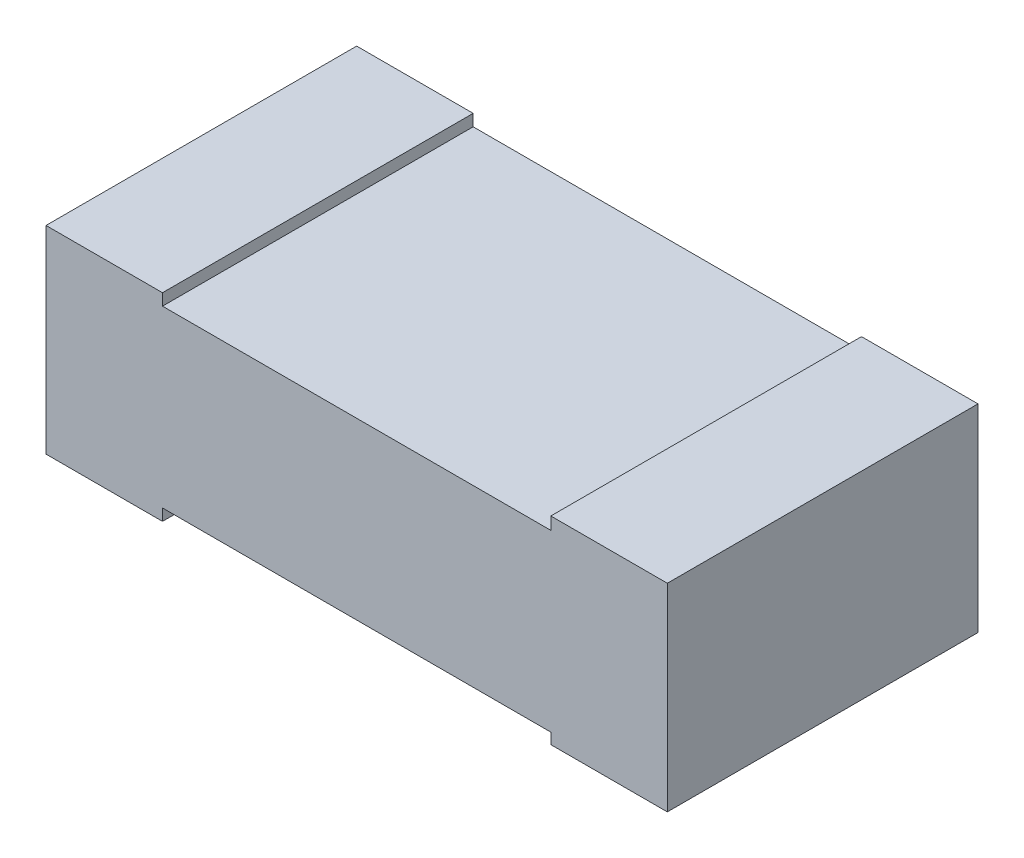
ISO-10303-21;
HEADER;
FILE_DESCRIPTION(('STEP AP214'),'2;1');
FILE_NAME('part.step','',(''),(''),'','','');
FILE_SCHEMA(('AUTOMOTIVE_DESIGN { 1 0 10303 214 1 1 1 1 }'));
ENDSEC;
DATA;
#1=APPLICATION_CONTEXT('core data for automotive mechanical design processes');
#2=APPLICATION_PROTOCOL_DEFINITION('international standard','automotive_design',2000,#1);
#3=PRODUCT_CONTEXT('',#1,'mechanical');
#4=PRODUCT('Part','Part','',(#3));
#5=PRODUCT_RELATED_PRODUCT_CATEGORY('part','',(#4));
#6=PRODUCT_DEFINITION_FORMATION('','',#4);
#7=PRODUCT_DEFINITION_CONTEXT('part definition',#1,'design');
#8=PRODUCT_DEFINITION('design','',#6,#7);
#9=PRODUCT_DEFINITION_SHAPE('','',#8);
#10=(LENGTH_UNIT() NAMED_UNIT(*) SI_UNIT(.MILLI.,.METRE.));
#11=(NAMED_UNIT(*) PLANE_ANGLE_UNIT() SI_UNIT($,.RADIAN.));
#12=(NAMED_UNIT(*) SI_UNIT($,.STERADIAN.) SOLID_ANGLE_UNIT());
#13=UNCERTAINTY_MEASURE_WITH_UNIT(LENGTH_MEASURE(1.E-05),#10,'distance_accuracy_value','');
#14=(GEOMETRIC_REPRESENTATION_CONTEXT(3) GLOBAL_UNCERTAINTY_ASSIGNED_CONTEXT((#13)) GLOBAL_UNIT_ASSIGNED_CONTEXT((#10,
#11,#12)) REPRESENTATION_CONTEXT('',''));
#15=CARTESIAN_POINT('',(0.,0.,0.));
#16=DIRECTION('',(0.,0.,1.));
#17=DIRECTION('',(1.,0.,0.));
#18=AXIS2_PLACEMENT_3D('',#15,#16,#17);
#19=CARTESIAN_POINT('',(0.8,0.,0.));
#20=DIRECTION('',(-1.,0.,0.));
#21=DIRECTION('',(0.,-1.,0.));
#22=AXIS2_PLACEMENT_3D('',#19,#20,#21);
#23=PLANE('',#22);
#24=DIRECTION('',(0.,0.,1.));
#25=VECTOR('',#24,1.);
#26=CARTESIAN_POINT('',(0.8,0.482093023256,0.4));
#27=LINE('',#26,#25);
#28=CARTESIAN_POINT('',(0.8,0.482093023256,0.4));
#29=VERTEX_POINT('',#28);
#30=CARTESIAN_POINT('',(0.8,0.482093023256,-0.4));
#31=VERTEX_POINT('',#30);
#32=EDGE_CURVE('E125',#29,#31,#27,.F.);
#33=ORIENTED_EDGE('',*,*,#32,.F.);
#34=DIRECTION('',(0.,1.,0.));
#35=VECTOR('',#34,1.);
#36=CARTESIAN_POINT('',(0.8,-0.02790697674419,0.4));
#37=LINE('',#36,#35);
#38=CARTESIAN_POINT('',(0.8,-0.02790697674419,0.4));
#39=VERTEX_POINT('',#38);
#40=EDGE_CURVE('E129',#39,#29,#37,.T.);
#41=ORIENTED_EDGE('',*,*,#40,.F.);
#42=DIRECTION('',(0.,0.,1.));
#43=VECTOR('',#42,1.);
#44=CARTESIAN_POINT('',(0.8,-0.02790697674419,-0.4));
#45=LINE('',#44,#43);
#46=CARTESIAN_POINT('',(0.8,-0.02790697674419,-0.4));
#47=VERTEX_POINT('',#46);
#48=EDGE_CURVE('E20',#47,#39,#45,.T.);
#49=ORIENTED_EDGE('',*,*,#48,.F.);
#50=DIRECTION('',(0.,1.,0.));
#51=VECTOR('',#50,1.);
#52=CARTESIAN_POINT('',(0.8,0.482093023256,-0.4));
#53=LINE('',#52,#51);
#54=EDGE_CURVE('E159',#31,#47,#53,.F.);
#55=ORIENTED_EDGE('',*,*,#54,.F.);
#56=EDGE_LOOP('',(#33,#41,#49,#55));
#57=FACE_BOUND('',#56,.T.);
#58=ADVANCED_FACE('F17',(#57),#23,.F.);
#59=CARTESIAN_POINT('',(0.8,-0.02790697674419,-0.4));
#60=DIRECTION('',(0.,-1.,0.));
#61=DIRECTION('',(1.,0.,0.));
#62=AXIS2_PLACEMENT_3D('',#59,#60,#61);
#63=PLANE('',#62);
#64=ORIENTED_EDGE('',*,*,#48,.T.);
#65=DIRECTION('',(1.,0.,0.));
#66=VECTOR('',#65,1.);
#67=CARTESIAN_POINT('',(0.8,-0.02790697674419,0.4));
#68=LINE('',#67,#66);
#69=CARTESIAN_POINT('',(0.5,-0.02790697674419,0.4));
#70=VERTEX_POINT('',#69);
#71=EDGE_CURVE('E122',#70,#39,#68,.T.);
#72=ORIENTED_EDGE('',*,*,#71,.F.);
#73=DIRECTION('',(0.,0.,1.));
#74=VECTOR('',#73,1.);
#75=CARTESIAN_POINT('',(0.5,-0.02790697674419,0.));
#76=LINE('',#75,#74);
#77=CARTESIAN_POINT('',(0.5,-0.0279069767441901,-0.4));
#78=VERTEX_POINT('',#77);
#79=EDGE_CURVE('E110',#78,#70,#76,.T.);
#80=ORIENTED_EDGE('',*,*,#79,.F.);
#81=DIRECTION('',(1.,0.,0.));
#82=VECTOR('',#81,1.);
#83=CARTESIAN_POINT('',(0.8,-0.02790697674419,-0.4));
#84=LINE('',#83,#82);
#85=EDGE_CURVE('E154',#47,#78,#84,.F.);
#86=ORIENTED_EDGE('',*,*,#85,.F.);
#87=EDGE_LOOP('',(#64,#72,#80,#86));
#88=FACE_BOUND('',#87,.T.);
#89=ADVANCED_FACE('F127',(#88),#63,.T.);
#90=CARTESIAN_POINT('',(0.5,0.,0.));
#91=DIRECTION('',(-1.,0.,0.));
#92=DIRECTION('',(0.,-1.,0.));
#93=AXIS2_PLACEMENT_3D('',#90,#91,#92);
#94=PLANE('',#93);
#95=ORIENTED_EDGE('',*,*,#79,.T.);
#96=DIRECTION('',(0.,1.,0.));
#97=VECTOR('',#96,1.);
#98=CARTESIAN_POINT('',(0.5,-0.02790697674419,0.4));
#99=LINE('',#98,#97);
#100=CARTESIAN_POINT('',(0.5,0.,0.4));
#101=VERTEX_POINT('',#100);
#102=EDGE_CURVE('E113',#101,#70,#99,.F.);
#103=ORIENTED_EDGE('',*,*,#102,.F.);
#104=DIRECTION('',(0.,0.,1.));
#105=VECTOR('',#104,1.);
#106=CARTESIAN_POINT('',(0.5,0.,0.4));
#107=LINE('',#106,#105);
#108=CARTESIAN_POINT('',(0.5,0.,-0.4));
#109=VERTEX_POINT('',#108);
#110=EDGE_CURVE('E103',#101,#109,#107,.F.);
#111=ORIENTED_EDGE('',*,*,#110,.T.);
#112=DIRECTION('',(0.,1.,0.));
#113=VECTOR('',#112,1.);
#114=CARTESIAN_POINT('',(0.5,0.482093023256,-0.4));
#115=LINE('',#114,#113);
#116=EDGE_CURVE('E114',#78,#109,#115,.T.);
#117=ORIENTED_EDGE('',*,*,#116,.F.);
#118=EDGE_LOOP('',(#95,#103,#111,#117));
#119=FACE_BOUND('',#118,.T.);
#120=ADVANCED_FACE('F112',(#119),#94,.T.);
#121=CARTESIAN_POINT('',(-0.5,0.,0.4));
#122=DIRECTION('',(0.,1.,0.));
#123=DIRECTION('',(-1.,0.,0.));
#124=AXIS2_PLACEMENT_3D('',#121,#122,#123);
#125=PLANE('',#124);
#126=DIRECTION('',(1.,0.,0.));
#127=VECTOR('',#126,1.);
#128=CARTESIAN_POINT('',(0.8,0.,0.4));
#129=LINE('',#128,#127);
#130=CARTESIAN_POINT('',(-0.5,0.,0.4));
#131=VERTEX_POINT('',#130);
#132=EDGE_CURVE('E124',#131,#101,#129,.T.);
#133=ORIENTED_EDGE('',*,*,#132,.F.);
#134=DIRECTION('',(0.,0.,-1.));
#135=VECTOR('',#134,1.);
#136=CARTESIAN_POINT('',(-0.5,0.,-0.4));
#137=LINE('',#136,#135);
#138=CARTESIAN_POINT('',(-0.5,0.,-0.4));
#139=VERTEX_POINT('',#138);
#140=EDGE_CURVE('E143',#139,#131,#137,.F.);
#141=ORIENTED_EDGE('',*,*,#140,.F.);
#142=DIRECTION('',(1.,0.,0.));
#143=VECTOR('',#142,1.);
#144=CARTESIAN_POINT('',(0.8,0.,-0.4));
#145=LINE('',#144,#143);
#146=EDGE_CURVE('E146',#109,#139,#145,.F.);
#147=ORIENTED_EDGE('',*,*,#146,.F.);
#148=ORIENTED_EDGE('',*,*,#110,.F.);
#149=EDGE_LOOP('',(#133,#141,#147,#148));
#150=FACE_BOUND('',#149,.T.);
#151=ADVANCED_FACE('F147',(#150),#125,.F.);
#152=CARTESIAN_POINT('',(-0.5,0.48,-0.4));
#153=DIRECTION('',(1.,0.,0.));
#154=DIRECTION('',(0.,0.,-1.));
#155=AXIS2_PLACEMENT_3D('',#152,#153,#154);
#156=PLANE('',#155);
#157=DIRECTION('',(0.,1.,0.));
#158=VECTOR('',#157,1.);
#159=CARTESIAN_POINT('',(-0.5,-0.02790697674419,0.4));
#160=LINE('',#159,#158);
#161=CARTESIAN_POINT('',(-0.5,-0.03,0.4));
#162=VERTEX_POINT('',#161);
#163=EDGE_CURVE('E170',#162,#131,#160,.T.);
#164=ORIENTED_EDGE('',*,*,#163,.F.);
#165=DIRECTION('',(0.,0.,-1.));
#166=VECTOR('',#165,1.);
#167=CARTESIAN_POINT('',(-0.5,-0.03,0.));
#168=LINE('',#167,#166);
#169=CARTESIAN_POINT('',(-0.5,-0.03,-0.4));
#170=VERTEX_POINT('',#169);
#171=EDGE_CURVE('E141',#170,#162,#168,.F.);
#172=ORIENTED_EDGE('',*,*,#171,.F.);
#173=DIRECTION('',(0.,1.,0.));
#174=VECTOR('',#173,1.);
#175=CARTESIAN_POINT('',(-0.5,0.482093023256,-0.4));
#176=LINE('',#175,#174);
#177=EDGE_CURVE('E150',#139,#170,#176,.F.);
#178=ORIENTED_EDGE('',*,*,#177,.F.);
#179=ORIENTED_EDGE('',*,*,#140,.T.);
#180=EDGE_LOOP('',(#164,#172,#178,#179));
#181=FACE_BOUND('',#180,.T.);
#182=ADVANCED_FACE('F233',(#181),#156,.T.);
#183=CARTESIAN_POINT('',(0.,-0.03,0.));
#184=DIRECTION('',(0.,-1.,0.));
#185=DIRECTION('',(0.,0.,-1.));
#186=AXIS2_PLACEMENT_3D('',#183,#184,#185);
#187=PLANE('',#186);
#188=DIRECTION('',(1.,0.,0.));
#189=VECTOR('',#188,1.);
#190=CARTESIAN_POINT('',(0.8,-0.03,-0.4));
#191=LINE('',#190,#189);
#192=CARTESIAN_POINT('',(-0.799997168259,-0.03,-0.4));
#193=VERTEX_POINT('',#192);
#194=EDGE_CURVE('E152',#170,#193,#191,.F.);
#195=ORIENTED_EDGE('',*,*,#194,.F.);
#196=ORIENTED_EDGE('',*,*,#171,.T.);
#197=DIRECTION('',(1.,0.,0.));
#198=VECTOR('',#197,1.);
#199=CARTESIAN_POINT('',(0.8,-0.03,0.4));
#200=LINE('',#199,#198);
#201=CARTESIAN_POINT('',(-0.799997168259,-0.03,0.4));
#202=VERTEX_POINT('',#201);
#203=EDGE_CURVE('E172',#202,#162,#200,.T.);
#204=ORIENTED_EDGE('',*,*,#203,.F.);
#205=DIRECTION('',(0.,0.,1.));
#206=VECTOR('',#205,1.);
#207=CARTESIAN_POINT('',(-0.799997168259,-0.03,0.4));
#208=LINE('',#207,#206);
#209=EDGE_CURVE('E139',#193,#202,#208,.T.);
#210=ORIENTED_EDGE('',*,*,#209,.F.);
#211=EDGE_LOOP('',(#195,#196,#204,#210));
#212=FACE_BOUND('',#211,.T.);
#213=ADVANCED_FACE('F210',(#212),#187,.T.);
#214=CARTESIAN_POINT('',(-0.799997168259,0.48,0.4));
#215=DIRECTION('',(-1.,0.,0.));
#216=DIRECTION('',(0.,0.,1.));
#217=AXIS2_PLACEMENT_3D('',#214,#215,#216);
#218=PLANE('',#217);
#219=DIRECTION('',(0.,0.,-1.));
#220=VECTOR('',#219,1.);
#221=CARTESIAN_POINT('',(-0.799997168259,0.48,0.));
#222=LINE('',#221,#220);
#223=CARTESIAN_POINT('',(-0.799997168259,0.48,0.4));
#224=VERTEX_POINT('',#223);
#225=CARTESIAN_POINT('',(-0.799997168259,0.48,-0.4));
#226=VERTEX_POINT('',#225);
#227=EDGE_CURVE('E136',#224,#226,#222,.T.);
#228=ORIENTED_EDGE('',*,*,#227,.T.);
#229=DIRECTION('',(0.,1.,0.));
#230=VECTOR('',#229,1.);
#231=CARTESIAN_POINT('',(-0.799997168259,0.482093023256,-0.4));
#232=LINE('',#231,#230);
#233=EDGE_CURVE('E202',#193,#226,#232,.T.);
#234=ORIENTED_EDGE('',*,*,#233,.F.);
#235=ORIENTED_EDGE('',*,*,#209,.T.);
#236=DIRECTION('',(0.,1.,0.));
#237=VECTOR('',#236,1.);
#238=CARTESIAN_POINT('',(-0.799997168259,-0.02790697674419,0.4));
#239=LINE('',#238,#237);
#240=EDGE_CURVE('E175',#224,#202,#239,.F.);
#241=ORIENTED_EDGE('',*,*,#240,.F.);
#242=EDGE_LOOP('',(#228,#234,#235,#241));
#243=FACE_BOUND('',#242,.T.);
#244=ADVANCED_FACE('F213',(#243),#218,.T.);
#245=CARTESIAN_POINT('',(0.,0.48,0.));
#246=DIRECTION('',(0.,-1.,0.));
#247=DIRECTION('',(0.,0.,-1.));
#248=AXIS2_PLACEMENT_3D('',#245,#246,#247);
#249=PLANE('',#248);
#250=DIRECTION('',(0.,0.,-1.));
#251=VECTOR('',#250,1.);
#252=CARTESIAN_POINT('',(-0.5,0.48,-0.4));
#253=LINE('',#252,#251);
#254=CARTESIAN_POINT('',(-0.5,0.48,-0.4));
#255=VERTEX_POINT('',#254);
#256=CARTESIAN_POINT('',(-0.5,0.48,0.4));
#257=VERTEX_POINT('',#256);
#258=EDGE_CURVE('E164',#255,#257,#253,.F.);
#259=ORIENTED_EDGE('',*,*,#258,.F.);
#260=DIRECTION('',(1.,0.,0.));
#261=VECTOR('',#260,1.);
#262=CARTESIAN_POINT('',(0.8,0.48,-0.4));
#263=LINE('',#262,#261);
#264=EDGE_CURVE('E200',#226,#255,#263,.T.);
#265=ORIENTED_EDGE('',*,*,#264,.F.);
#266=ORIENTED_EDGE('',*,*,#227,.F.);
#267=DIRECTION('',(1.,0.,0.));
#268=VECTOR('',#267,1.);
#269=CARTESIAN_POINT('',(0.8,0.48,0.4));
#270=LINE('',#269,#268);
#271=EDGE_CURVE('E178',#257,#224,#270,.F.);
#272=ORIENTED_EDGE('',*,*,#271,.F.);
#273=EDGE_LOOP('',(#259,#265,#266,#272));
#274=FACE_BOUND('',#273,.T.);
#275=ADVANCED_FACE('F217',(#274),#249,.F.);
#276=CARTESIAN_POINT('',(0.8,0.482093023256,0.4));
#277=DIRECTION('',(0.,1.,0.));
#278=DIRECTION('',(-1.,0.,0.));
#279=AXIS2_PLACEMENT_3D('',#276,#277,#278);
#280=PLANE('',#279);
#281=ORIENTED_EDGE('',*,*,#32,.T.);
#282=DIRECTION('',(1.,0.,0.));
#283=VECTOR('',#282,1.);
#284=CARTESIAN_POINT('',(0.8,0.482093023256,-0.4));
#285=LINE('',#284,#283);
#286=CARTESIAN_POINT('',(0.5,0.482093023256,-0.4));
#287=VERTEX_POINT('',#286);
#288=EDGE_CURVE('E161',#287,#31,#285,.T.);
#289=ORIENTED_EDGE('',*,*,#288,.F.);
#290=DIRECTION('',(0.,0.,1.));
#291=VECTOR('',#290,1.);
#292=CARTESIAN_POINT('',(0.5,0.482093023256,0.));
#293=LINE('',#292,#291);
#294=CARTESIAN_POINT('',(0.5,0.482093023256,0.4));
#295=VERTEX_POINT('',#294);
#296=EDGE_CURVE('E189',#295,#287,#293,.F.);
#297=ORIENTED_EDGE('',*,*,#296,.F.);
#298=DIRECTION('',(1.,0.,0.));
#299=VECTOR('',#298,1.);
#300=CARTESIAN_POINT('',(0.8,0.482093023256,0.4));
#301=LINE('',#300,#299);
#302=EDGE_CURVE('E131',#29,#295,#301,.F.);
#303=ORIENTED_EDGE('',*,*,#302,.F.);
#304=EDGE_LOOP('',(#281,#289,#297,#303));
#305=FACE_BOUND('',#304,.T.);
#306=ADVANCED_FACE('F193',(#305),#280,.T.);
#307=CARTESIAN_POINT('',(0.8,-0.02790697674419,0.4));
#308=DIRECTION('',(0.,0.,1.));
#309=DIRECTION('',(1.,0.,0.));
#310=AXIS2_PLACEMENT_3D('',#307,#308,#309);
#311=PLANE('',#310);
#312=ORIENTED_EDGE('',*,*,#163,.T.);
#313=ORIENTED_EDGE('',*,*,#132,.T.);
#314=ORIENTED_EDGE('',*,*,#102,.T.);
#315=ORIENTED_EDGE('',*,*,#71,.T.);
#316=ORIENTED_EDGE('',*,*,#40,.T.);
#317=ORIENTED_EDGE('',*,*,#302,.T.);
#318=DIRECTION('',(0.,-1.,0.));
#319=VECTOR('',#318,1.);
#320=CARTESIAN_POINT('',(0.5,0.,0.4));
#321=LINE('',#320,#319);
#322=CARTESIAN_POINT('',(0.5,0.45,0.4));
#323=VERTEX_POINT('',#322);
#324=EDGE_CURVE('E184',#323,#295,#321,.F.);
#325=ORIENTED_EDGE('',*,*,#324,.F.);
#326=DIRECTION('',(1.,0.,0.));
#327=VECTOR('',#326,1.);
#328=CARTESIAN_POINT('',(-0.5,0.45,0.4));
#329=LINE('',#328,#327);
#330=CARTESIAN_POINT('',(-0.5,0.45,0.4));
#331=VERTEX_POINT('',#330);
#332=EDGE_CURVE('E195',#323,#331,#329,.F.);
#333=ORIENTED_EDGE('',*,*,#332,.T.);
#334=DIRECTION('',(0.,1.,0.));
#335=VECTOR('',#334,1.);
#336=CARTESIAN_POINT('',(-0.5,0.48,0.4));
#337=LINE('',#336,#335);
#338=EDGE_CURVE('E167',#257,#331,#337,.F.);
#339=ORIENTED_EDGE('',*,*,#338,.F.);
#340=ORIENTED_EDGE('',*,*,#271,.T.);
#341=ORIENTED_EDGE('',*,*,#240,.T.);
#342=ORIENTED_EDGE('',*,*,#203,.T.);
#343=EDGE_LOOP('',(#312,#313,#314,#315,#316,#317,#325,#333,#339,#340,#341,#342));
#344=FACE_BOUND('',#343,.T.);
#345=ADVANCED_FACE('F121',(#344),#311,.T.);
#346=CARTESIAN_POINT('',(-0.5,0.48,-0.4));
#347=DIRECTION('',(1.,0.,0.));
#348=DIRECTION('',(0.,0.,-1.));
#349=AXIS2_PLACEMENT_3D('',#346,#347,#348);
#350=PLANE('',#349);
#351=DIRECTION('',(0.,1.,0.));
#352=VECTOR('',#351,1.);
#353=CARTESIAN_POINT('',(-0.5,0.482093023256,-0.4));
#354=LINE('',#353,#352);
#355=CARTESIAN_POINT('',(-0.5,0.45,-0.4));
#356=VERTEX_POINT('',#355);
#357=EDGE_CURVE('E191',#255,#356,#354,.F.);
#358=ORIENTED_EDGE('',*,*,#357,.F.);
#359=ORIENTED_EDGE('',*,*,#258,.T.);
#360=ORIENTED_EDGE('',*,*,#338,.T.);
#361=DIRECTION('',(0.,0.,1.));
#362=VECTOR('',#361,1.);
#363=CARTESIAN_POINT('',(-0.5,0.45,-0.4));
#364=LINE('',#363,#362);
#365=EDGE_CURVE('E226',#331,#356,#364,.F.);
#366=ORIENTED_EDGE('',*,*,#365,.T.);
#367=EDGE_LOOP('',(#358,#359,#360,#366));
#368=FACE_BOUND('',#367,.T.);
#369=ADVANCED_FACE('F228',(#368),#350,.T.);
#370=CARTESIAN_POINT('',(0.8,0.482093023256,-0.4));
#371=DIRECTION('',(0.,0.,-1.));
#372=DIRECTION('',(0.,1.,0.));
#373=AXIS2_PLACEMENT_3D('',#370,#371,#372);
#374=PLANE('',#373);
#375=ORIENTED_EDGE('',*,*,#357,.T.);
#376=DIRECTION('',(1.,0.,0.));
#377=VECTOR('',#376,1.);
#378=CARTESIAN_POINT('',(-0.5,0.45,-0.4));
#379=LINE('',#378,#377);
#380=CARTESIAN_POINT('',(0.5,0.45,-0.4));
#381=VERTEX_POINT('',#380);
#382=EDGE_CURVE('E26',#356,#381,#379,.T.);
#383=ORIENTED_EDGE('',*,*,#382,.T.);
#384=DIRECTION('',(0.,-1.,0.));
#385=VECTOR('',#384,1.);
#386=CARTESIAN_POINT('',(0.5,0.,-0.4));
#387=LINE('',#386,#385);
#388=EDGE_CURVE('E34',#287,#381,#387,.T.);
#389=ORIENTED_EDGE('',*,*,#388,.F.);
#390=ORIENTED_EDGE('',*,*,#288,.T.);
#391=ORIENTED_EDGE('',*,*,#54,.T.);
#392=ORIENTED_EDGE('',*,*,#85,.T.);
#393=ORIENTED_EDGE('',*,*,#116,.T.);
#394=ORIENTED_EDGE('',*,*,#146,.T.);
#395=ORIENTED_EDGE('',*,*,#177,.T.);
#396=ORIENTED_EDGE('',*,*,#194,.T.);
#397=ORIENTED_EDGE('',*,*,#233,.T.);
#398=ORIENTED_EDGE('',*,*,#264,.T.);
#399=EDGE_LOOP('',(#375,#383,#389,#390,#391,#392,#393,#394,#395,#396,#397,#398));
#400=FACE_BOUND('',#399,.T.);
#401=ADVANCED_FACE('F205',(#400),#374,.T.);
#402=CARTESIAN_POINT('',(0.5,0.,0.));
#403=DIRECTION('',(-1.,0.,0.));
#404=DIRECTION('',(0.,-1.,0.));
#405=AXIS2_PLACEMENT_3D('',#402,#403,#404);
#406=PLANE('',#405);
#407=ORIENTED_EDGE('',*,*,#296,.T.);
#408=ORIENTED_EDGE('',*,*,#388,.T.);
#409=DIRECTION('',(0.,0.,1.));
#410=VECTOR('',#409,1.);
#411=CARTESIAN_POINT('',(0.5,0.45,-0.4));
#412=LINE('',#411,#410);
#413=EDGE_CURVE('E11',#381,#323,#412,.T.);
#414=ORIENTED_EDGE('',*,*,#413,.T.);
#415=ORIENTED_EDGE('',*,*,#324,.T.);
#416=EDGE_LOOP('',(#407,#408,#414,#415));
#417=FACE_BOUND('',#416,.T.);
#418=ADVANCED_FACE('F188',(#417),#406,.T.);
#419=CARTESIAN_POINT('',(-0.5,0.45,-0.4));
#420=DIRECTION('',(0.,-1.,0.));
#421=DIRECTION('',(1.,0.,0.));
#422=AXIS2_PLACEMENT_3D('',#419,#420,#421);
#423=PLANE('',#422);
#424=ORIENTED_EDGE('',*,*,#382,.F.);
#425=ORIENTED_EDGE('',*,*,#365,.F.);
#426=ORIENTED_EDGE('',*,*,#332,.F.);
#427=ORIENTED_EDGE('',*,*,#413,.F.);
#428=EDGE_LOOP('',(#424,#425,#426,#427));
#429=FACE_BOUND('',#428,.T.);
#430=ADVANCED_FACE('F225',(#429),#423,.F.);
#431=CLOSED_SHELL('',(#58,#89,#120,#151,#182,#213,#244,#275,#306,#345,#369,#401,#418,#430));
#432=MANIFOLD_SOLID_BREP('B1',#431);
#433=ADVANCED_BREP_SHAPE_REPRESENTATION('',(#18,#432),#14);
#434=SHAPE_DEFINITION_REPRESENTATION(#9,#433);
ENDSEC;
END-ISO-10303-21;
